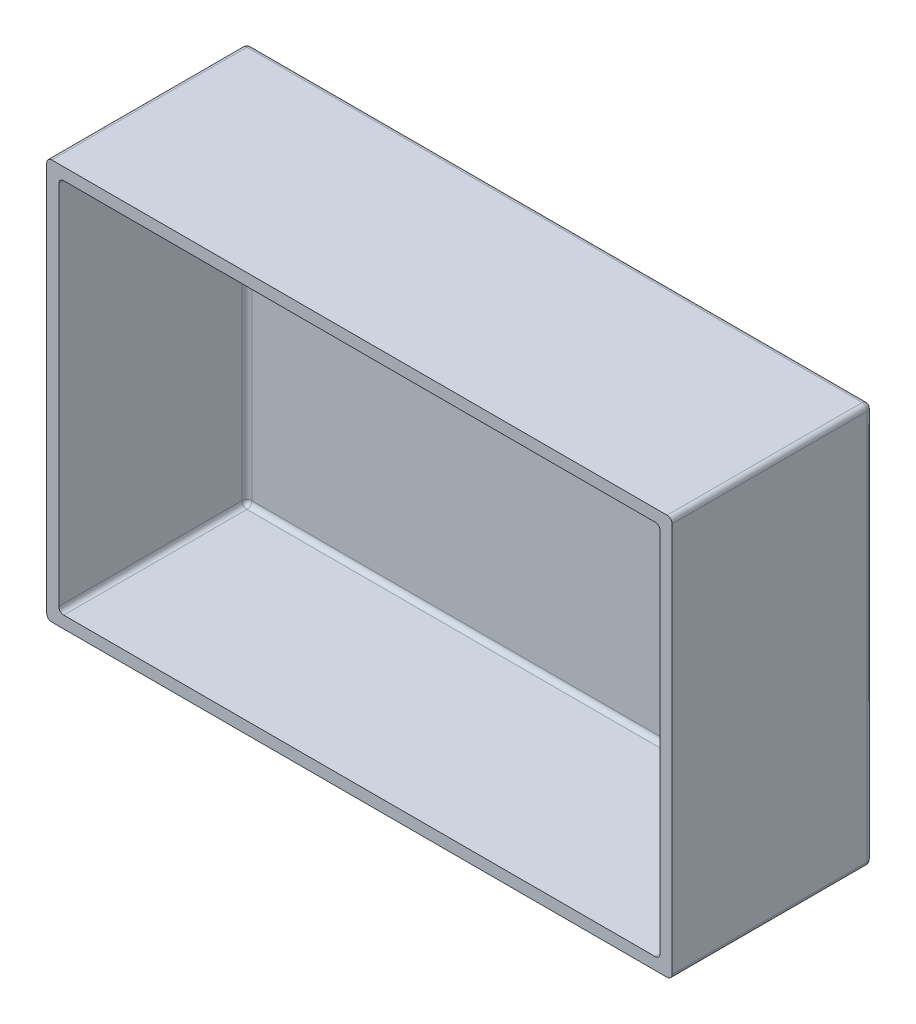
ISO-10303-21;
HEADER;
FILE_DESCRIPTION(('STEP AP214'),'2;1');
FILE_NAME('part.step','',(''),(''),'','','');
FILE_SCHEMA(('AUTOMOTIVE_DESIGN { 1 0 10303 214 1 1 1 1 }'));
ENDSEC;
DATA;
#1=APPLICATION_CONTEXT('core data for automotive mechanical design processes');
#2=APPLICATION_PROTOCOL_DEFINITION('international standard','automotive_design',2000,#1);
#3=PRODUCT_CONTEXT('',#1,'mechanical');
#4=PRODUCT('Part','Part','',(#3));
#5=PRODUCT_RELATED_PRODUCT_CATEGORY('part','',(#4));
#6=PRODUCT_DEFINITION_FORMATION('','',#4);
#7=PRODUCT_DEFINITION_CONTEXT('part definition',#1,'design');
#8=PRODUCT_DEFINITION('design','',#6,#7);
#9=PRODUCT_DEFINITION_SHAPE('','',#8);
#10=(LENGTH_UNIT() NAMED_UNIT(*) SI_UNIT(.MILLI.,.METRE.));
#11=(NAMED_UNIT(*) PLANE_ANGLE_UNIT() SI_UNIT($,.RADIAN.));
#12=(NAMED_UNIT(*) SI_UNIT($,.STERADIAN.) SOLID_ANGLE_UNIT());
#13=UNCERTAINTY_MEASURE_WITH_UNIT(LENGTH_MEASURE(1.E-05),#10,'distance_accuracy_value','');
#14=(GEOMETRIC_REPRESENTATION_CONTEXT(3) GLOBAL_UNCERTAINTY_ASSIGNED_CONTEXT((#13)) GLOBAL_UNIT_ASSIGNED_CONTEXT((#10,
#11,#12)) REPRESENTATION_CONTEXT('',''));
#15=CARTESIAN_POINT('',(0.,0.,0.));
#16=DIRECTION('',(0.,0.,1.));
#17=DIRECTION('',(1.,0.,0.));
#18=AXIS2_PLACEMENT_3D('',#15,#16,#17);
#19=CARTESIAN_POINT('',(62.5,40.,40.));
#20=DIRECTION('',(-1.,0.,0.));
#21=DIRECTION('',(0.,0.,1.));
#22=AXIS2_PLACEMENT_3D('',#19,#20,#21);
#23=PLANE('',#22);
#24=DIRECTION('',(0.,1.,0.));
#25=VECTOR('',#24,1.);
#26=CARTESIAN_POINT('',(62.5,40.,40.));
#27=LINE('',#26,#25);
#28=CARTESIAN_POINT('',(62.5,-39.,40.));
#29=VERTEX_POINT('',#28);
#30=CARTESIAN_POINT('',(62.5,39.,40.));
#31=VERTEX_POINT('',#30);
#32=EDGE_CURVE('E359',#29,#31,#27,.T.);
#33=ORIENTED_EDGE('',*,*,#32,.F.);
#34=DIRECTION('',(0.,0.,-1.));
#35=VECTOR('',#34,1.);
#36=CARTESIAN_POINT('',(62.5,-39.,40.));
#37=LINE('',#36,#35);
#38=CARTESIAN_POINT('',(62.5,-39.,1.));
#39=VERTEX_POINT('',#38);
#40=EDGE_CURVE('E220',#29,#39,#37,.T.);
#41=ORIENTED_EDGE('',*,*,#40,.T.);
#42=DIRECTION('',(0.,1.,0.));
#43=VECTOR('',#42,1.);
#44=CARTESIAN_POINT('',(62.5,40.,1.));
#45=LINE('',#44,#43);
#46=CARTESIAN_POINT('',(62.5,39.,1.));
#47=VERTEX_POINT('',#46);
#48=EDGE_CURVE('E216',#39,#47,#45,.T.);
#49=ORIENTED_EDGE('',*,*,#48,.T.);
#50=DIRECTION('',(0.,0.,-1.));
#51=VECTOR('',#50,1.);
#52=CARTESIAN_POINT('',(62.5,39.,40.));
#53=LINE('',#52,#51);
#54=EDGE_CURVE('E218',#47,#31,#53,.F.);
#55=ORIENTED_EDGE('',*,*,#54,.T.);
#56=EDGE_LOOP('',(#33,#41,#49,#55));
#57=FACE_BOUND('',#56,.T.);
#58=ADVANCED_FACE('F36',(#57),#23,.F.);
#59=CARTESIAN_POINT('',(-62.5,40.,40.));
#60=DIRECTION('',(0.,-1.,0.));
#61=DIRECTION('',(0.,0.,-1.));
#62=AXIS2_PLACEMENT_3D('',#59,#60,#61);
#63=PLANE('',#62);
#64=DIRECTION('',(-1.,0.,0.));
#65=VECTOR('',#64,1.);
#66=CARTESIAN_POINT('',(-62.5,40.,40.));
#67=LINE('',#66,#65);
#68=CARTESIAN_POINT('',(61.5,40.,40.));
#69=VERTEX_POINT('',#68);
#70=CARTESIAN_POINT('',(-61.5,40.,40.));
#71=VERTEX_POINT('',#70);
#72=EDGE_CURVE('E182',#69,#71,#67,.T.);
#73=ORIENTED_EDGE('',*,*,#72,.F.);
#74=DIRECTION('',(0.,0.,-1.));
#75=VECTOR('',#74,1.);
#76=CARTESIAN_POINT('',(61.5,40.,40.));
#77=LINE('',#76,#75);
#78=CARTESIAN_POINT('',(61.5,40.,1.));
#79=VERTEX_POINT('',#78);
#80=EDGE_CURVE('E236',#69,#79,#77,.T.);
#81=ORIENTED_EDGE('',*,*,#80,.T.);
#82=DIRECTION('',(-1.,0.,0.));
#83=VECTOR('',#82,1.);
#84=CARTESIAN_POINT('',(-62.5,40.,1.));
#85=LINE('',#84,#83);
#86=CARTESIAN_POINT('',(-61.5,40.,1.));
#87=VERTEX_POINT('',#86);
#88=EDGE_CURVE('E234',#79,#87,#85,.T.);
#89=ORIENTED_EDGE('',*,*,#88,.T.);
#90=DIRECTION('',(0.,0.,-1.));
#91=VECTOR('',#90,1.);
#92=CARTESIAN_POINT('',(-61.5,40.,40.));
#93=LINE('',#92,#91);
#94=EDGE_CURVE('E232',#87,#71,#93,.F.);
#95=ORIENTED_EDGE('',*,*,#94,.T.);
#96=EDGE_LOOP('',(#73,#81,#89,#95));
#97=FACE_BOUND('',#96,.T.);
#98=ADVANCED_FACE('F398',(#97),#63,.F.);
#99=CARTESIAN_POINT('',(-62.5,40.,40.));
#100=DIRECTION('',(1.,0.,0.));
#101=DIRECTION('',(0.,0.,-1.));
#102=AXIS2_PLACEMENT_3D('',#99,#100,#101);
#103=PLANE('',#102);
#104=DIRECTION('',(0.,-1.,0.));
#105=VECTOR('',#104,1.);
#106=CARTESIAN_POINT('',(-62.5,40.,40.));
#107=LINE('',#106,#105);
#108=CARTESIAN_POINT('',(-62.5,39.,40.));
#109=VERTEX_POINT('',#108);
#110=CARTESIAN_POINT('',(-62.5,-39.,40.));
#111=VERTEX_POINT('',#110);
#112=EDGE_CURVE('E179',#109,#111,#107,.T.);
#113=ORIENTED_EDGE('',*,*,#112,.F.);
#114=DIRECTION('',(0.,0.,-1.));
#115=VECTOR('',#114,1.);
#116=CARTESIAN_POINT('',(-62.5,39.,40.));
#117=LINE('',#116,#115);
#118=CARTESIAN_POINT('',(-62.5,39.,1.));
#119=VERTEX_POINT('',#118);
#120=EDGE_CURVE('E192',#109,#119,#117,.T.);
#121=ORIENTED_EDGE('',*,*,#120,.T.);
#122=DIRECTION('',(0.,-1.,0.));
#123=VECTOR('',#122,1.);
#124=CARTESIAN_POINT('',(-62.5,40.,1.));
#125=LINE('',#124,#123);
#126=CARTESIAN_POINT('',(-62.5,-39.,1.));
#127=VERTEX_POINT('',#126);
#128=EDGE_CURVE('E203',#119,#127,#125,.T.);
#129=ORIENTED_EDGE('',*,*,#128,.T.);
#130=DIRECTION('',(0.,0.,-1.));
#131=VECTOR('',#130,1.);
#132=CARTESIAN_POINT('',(-62.5,-39.,40.));
#133=LINE('',#132,#131);
#134=EDGE_CURVE('E195',#127,#111,#133,.F.);
#135=ORIENTED_EDGE('',*,*,#134,.T.);
#136=EDGE_LOOP('',(#113,#121,#129,#135));
#137=FACE_BOUND('',#136,.T.);
#138=ADVANCED_FACE('F190',(#137),#103,.F.);
#139=CARTESIAN_POINT('',(-62.5,-40.,40.));
#140=DIRECTION('',(0.,1.,0.));
#141=DIRECTION('',(0.,0.,1.));
#142=AXIS2_PLACEMENT_3D('',#139,#140,#141);
#143=PLANE('',#142);
#144=DIRECTION('',(1.,0.,0.));
#145=VECTOR('',#144,1.);
#146=CARTESIAN_POINT('',(-62.5,-40.,1.));
#147=LINE('',#146,#145);
#148=CARTESIAN_POINT('',(-61.5,-40.,1.));
#149=VERTEX_POINT('',#148);
#150=CARTESIAN_POINT('',(61.5,-40.,1.));
#151=VERTEX_POINT('',#150);
#152=EDGE_CURVE('E222',#149,#151,#147,.T.);
#153=ORIENTED_EDGE('',*,*,#152,.T.);
#154=DIRECTION('',(0.,0.,-1.));
#155=VECTOR('',#154,1.);
#156=CARTESIAN_POINT('',(61.5,-40.,40.));
#157=LINE('',#156,#155);
#158=CARTESIAN_POINT('',(61.5,-40.,40.));
#159=VERTEX_POINT('',#158);
#160=EDGE_CURVE('E226',#151,#159,#157,.F.);
#161=ORIENTED_EDGE('',*,*,#160,.T.);
#162=DIRECTION('',(1.,0.,0.));
#163=VECTOR('',#162,1.);
#164=CARTESIAN_POINT('',(-62.5,-40.,40.));
#165=LINE('',#164,#163);
#166=CARTESIAN_POINT('',(-61.5,-40.,40.));
#167=VERTEX_POINT('',#166);
#168=EDGE_CURVE('E196',#167,#159,#165,.T.);
#169=ORIENTED_EDGE('',*,*,#168,.F.);
#170=DIRECTION('',(0.,0.,-1.));
#171=VECTOR('',#170,1.);
#172=CARTESIAN_POINT('',(-61.5,-40.,40.));
#173=LINE('',#172,#171);
#174=EDGE_CURVE('E224',#167,#149,#173,.T.);
#175=ORIENTED_EDGE('',*,*,#174,.T.);
#176=EDGE_LOOP('',(#153,#161,#169,#175));
#177=FACE_BOUND('',#176,.T.);
#178=ADVANCED_FACE('F417',(#177),#143,.F.);
#179=CARTESIAN_POINT('',(0.,0.,40.));
#180=DIRECTION('',(0.,0.,1.));
#181=DIRECTION('',(1.,0.,0.));
#182=AXIS2_PLACEMENT_3D('',#179,#180,#181);
#183=PLANE('',#182);
#184=DIRECTION('',(0.,1.,0.));
#185=VECTOR('',#184,1.);
#186=CARTESIAN_POINT('',(60.1,37.6,40.));
#187=LINE('',#186,#185);
#188=CARTESIAN_POINT('',(60.1,-36.6,40.));
#189=VERTEX_POINT('',#188);
#190=CARTESIAN_POINT('',(60.1,36.6,40.));
#191=VERTEX_POINT('',#190);
#192=EDGE_CURVE('E271',#189,#191,#187,.T.);
#193=ORIENTED_EDGE('',*,*,#192,.F.);
#194=CARTESIAN_POINT('',(59.1,-36.6,40.));
#195=DIRECTION('',(0.,0.,1.));
#196=DIRECTION('',(1.,0.,0.));
#197=AXIS2_PLACEMENT_3D('',#194,#195,#196);
#198=CIRCLE('',#197,1.);
#199=CARTESIAN_POINT('',(59.1,-37.6,40.));
#200=VERTEX_POINT('',#199);
#201=EDGE_CURVE('E305',#189,#200,#198,.F.);
#202=ORIENTED_EDGE('',*,*,#201,.T.);
#203=DIRECTION('',(1.,0.,0.));
#204=VECTOR('',#203,1.);
#205=CARTESIAN_POINT('',(-60.1,-37.6,40.));
#206=LINE('',#205,#204);
#207=CARTESIAN_POINT('',(-59.1,-37.6,40.));
#208=VERTEX_POINT('',#207);
#209=EDGE_CURVE('E353',#208,#200,#206,.T.);
#210=ORIENTED_EDGE('',*,*,#209,.F.);
#211=CARTESIAN_POINT('',(-59.1,-36.6,40.));
#212=DIRECTION('',(0.,0.,1.));
#213=DIRECTION('',(1.,0.,0.));
#214=AXIS2_PLACEMENT_3D('',#211,#212,#213);
#215=CIRCLE('',#214,1.);
#216=CARTESIAN_POINT('',(-60.1,-36.6,40.));
#217=VERTEX_POINT('',#216);
#218=EDGE_CURVE('E11',#208,#217,#215,.F.);
#219=ORIENTED_EDGE('',*,*,#218,.T.);
#220=DIRECTION('',(0.,-1.,0.));
#221=VECTOR('',#220,1.);
#222=CARTESIAN_POINT('',(-60.1,37.6,40.));
#223=LINE('',#222,#221);
#224=CARTESIAN_POINT('',(-60.1,36.6,40.));
#225=VERTEX_POINT('',#224);
#226=EDGE_CURVE('E360',#225,#217,#223,.T.);
#227=ORIENTED_EDGE('',*,*,#226,.F.);
#228=CARTESIAN_POINT('',(-59.1,36.6,40.));
#229=DIRECTION('',(0.,0.,1.));
#230=DIRECTION('',(1.,0.,0.));
#231=AXIS2_PLACEMENT_3D('',#228,#229,#230);
#232=CIRCLE('',#231,1.);
#233=CARTESIAN_POINT('',(-59.1,37.6,40.));
#234=VERTEX_POINT('',#233);
#235=EDGE_CURVE('E45',#225,#234,#232,.F.);
#236=ORIENTED_EDGE('',*,*,#235,.T.);
#237=DIRECTION('',(-1.,0.,0.));
#238=VECTOR('',#237,1.);
#239=CARTESIAN_POINT('',(-60.1,37.6,40.));
#240=LINE('',#239,#238);
#241=CARTESIAN_POINT('',(59.1,37.6,40.));
#242=VERTEX_POINT('',#241);
#243=EDGE_CURVE('E364',#242,#234,#240,.T.);
#244=ORIENTED_EDGE('',*,*,#243,.F.);
#245=CARTESIAN_POINT('',(59.1,36.6,40.));
#246=DIRECTION('',(0.,0.,1.));
#247=DIRECTION('',(1.,0.,0.));
#248=AXIS2_PLACEMENT_3D('',#245,#246,#247);
#249=CIRCLE('',#248,1.);
#250=EDGE_CURVE('E303',#242,#191,#249,.F.);
#251=ORIENTED_EDGE('',*,*,#250,.T.);
#252=EDGE_LOOP('',(#193,#202,#210,#219,#227,#236,#244,#251));
#253=FACE_BOUND('',#252,.T.);
#254=ORIENTED_EDGE('',*,*,#168,.T.);
#255=CARTESIAN_POINT('',(61.5,-39.,40.));
#256=DIRECTION('',(0.,0.,1.));
#257=DIRECTION('',(1.,0.,0.));
#258=AXIS2_PLACEMENT_3D('',#255,#256,#257);
#259=CIRCLE('',#258,1.);
#260=EDGE_CURVE('E230',#159,#29,#259,.T.);
#261=ORIENTED_EDGE('',*,*,#260,.T.);
#262=ORIENTED_EDGE('',*,*,#32,.T.);
#263=CARTESIAN_POINT('',(61.5,39.,40.));
#264=DIRECTION('',(0.,0.,1.));
#265=DIRECTION('',(1.,0.,0.));
#266=AXIS2_PLACEMENT_3D('',#263,#264,#265);
#267=CIRCLE('',#266,1.);
#268=EDGE_CURVE('E186',#31,#69,#267,.T.);
#269=ORIENTED_EDGE('',*,*,#268,.T.);
#270=ORIENTED_EDGE('',*,*,#72,.T.);
#271=CARTESIAN_POINT('',(-61.5,39.,40.));
#272=DIRECTION('',(0.,0.,1.));
#273=DIRECTION('',(1.,0.,0.));
#274=AXIS2_PLACEMENT_3D('',#271,#272,#273);
#275=CIRCLE('',#274,1.);
#276=EDGE_CURVE('E175',#71,#109,#275,.T.);
#277=ORIENTED_EDGE('',*,*,#276,.T.);
#278=ORIENTED_EDGE('',*,*,#112,.T.);
#279=CARTESIAN_POINT('',(-61.5,-39.,40.));
#280=DIRECTION('',(0.,0.,1.));
#281=DIRECTION('',(1.,0.,0.));
#282=AXIS2_PLACEMENT_3D('',#279,#280,#281);
#283=CIRCLE('',#282,1.);
#284=EDGE_CURVE('E187',#111,#167,#283,.T.);
#285=ORIENTED_EDGE('',*,*,#284,.T.);
#286=EDGE_LOOP('',(#254,#261,#262,#269,#270,#277,#278,#285));
#287=FACE_BOUND('',#286,.T.);
#288=ADVANCED_FACE('F178',(#253,#287),#183,.T.);
#289=CARTESIAN_POINT('',(0.,0.,0.));
#290=DIRECTION('',(0.,0.,1.));
#291=DIRECTION('',(1.,0.,0.));
#292=AXIS2_PLACEMENT_3D('',#289,#290,#291);
#293=PLANE('',#292);
#294=DIRECTION('',(0.,-1.,0.));
#295=VECTOR('',#294,1.);
#296=CARTESIAN_POINT('',(-61.5,0.,0.));
#297=LINE('',#296,#295);
#298=CARTESIAN_POINT('',(-61.5,-39.,0.));
#299=VERTEX_POINT('',#298);
#300=CARTESIAN_POINT('',(-61.5,39.,0.));
#301=VERTEX_POINT('',#300);
#302=EDGE_CURVE('E211',#299,#301,#297,.F.);
#303=ORIENTED_EDGE('',*,*,#302,.T.);
#304=DIRECTION('',(-1.,0.,0.));
#305=VECTOR('',#304,1.);
#306=CARTESIAN_POINT('',(0.,39.,0.));
#307=LINE('',#306,#305);
#308=CARTESIAN_POINT('',(61.5,39.,0.));
#309=VERTEX_POINT('',#308);
#310=EDGE_CURVE('E214',#301,#309,#307,.F.);
#311=ORIENTED_EDGE('',*,*,#310,.T.);
#312=DIRECTION('',(0.,1.,0.));
#313=VECTOR('',#312,1.);
#314=CARTESIAN_POINT('',(61.5,0.,0.));
#315=LINE('',#314,#313);
#316=CARTESIAN_POINT('',(61.5,-39.,0.));
#317=VERTEX_POINT('',#316);
#318=EDGE_CURVE('E205',#309,#317,#315,.F.);
#319=ORIENTED_EDGE('',*,*,#318,.T.);
#320=DIRECTION('',(1.,0.,0.));
#321=VECTOR('',#320,1.);
#322=CARTESIAN_POINT('',(0.,-39.,0.));
#323=LINE('',#322,#321);
#324=EDGE_CURVE('E202',#317,#299,#323,.F.);
#325=ORIENTED_EDGE('',*,*,#324,.T.);
#326=EDGE_LOOP('',(#303,#311,#319,#325));
#327=FACE_BOUND('',#326,.T.);
#328=ADVANCED_FACE('F678',(#327),#293,.F.);
#329=CARTESIAN_POINT('',(60.1,37.6,2.4));
#330=DIRECTION('',(1.,0.,0.));
#331=DIRECTION('',(0.,0.,-1.));
#332=AXIS2_PLACEMENT_3D('',#329,#330,#331);
#333=PLANE('',#332);
#334=ORIENTED_EDGE('',*,*,#192,.T.);
#335=DIRECTION('',(0.,0.,1.));
#336=VECTOR('',#335,1.);
#337=CARTESIAN_POINT('',(60.1,36.6,2.4));
#338=LINE('',#337,#336);
#339=CARTESIAN_POINT('',(60.1,36.6,3.4));
#340=VERTEX_POINT('',#339);
#341=EDGE_CURVE('E282',#191,#340,#338,.F.);
#342=ORIENTED_EDGE('',*,*,#341,.T.);
#343=DIRECTION('',(0.,1.,0.));
#344=VECTOR('',#343,1.);
#345=CARTESIAN_POINT('',(60.1,37.6,3.4));
#346=LINE('',#345,#344);
#347=CARTESIAN_POINT('',(60.1,-36.6,3.4));
#348=VERTEX_POINT('',#347);
#349=EDGE_CURVE('E280',#340,#348,#346,.F.);
#350=ORIENTED_EDGE('',*,*,#349,.T.);
#351=DIRECTION('',(0.,0.,1.));
#352=VECTOR('',#351,1.);
#353=CARTESIAN_POINT('',(60.1,-36.6,40.));
#354=LINE('',#353,#352);
#355=EDGE_CURVE('E278',#348,#189,#354,.T.);
#356=ORIENTED_EDGE('',*,*,#355,.T.);
#357=EDGE_LOOP('',(#334,#342,#350,#356));
#358=FACE_BOUND('',#357,.T.);
#359=ADVANCED_FACE('F670',(#358),#333,.F.);
#360=CARTESIAN_POINT('',(-60.1,-37.6,2.4));
#361=DIRECTION('',(0.,-1.,0.));
#362=DIRECTION('',(0.,0.,-1.));
#363=AXIS2_PLACEMENT_3D('',#360,#361,#362);
#364=PLANE('',#363);
#365=ORIENTED_EDGE('',*,*,#209,.T.);
#366=DIRECTION('',(0.,0.,1.));
#367=VECTOR('',#366,1.);
#368=CARTESIAN_POINT('',(59.1,-37.6,2.4));
#369=LINE('',#368,#367);
#370=CARTESIAN_POINT('',(59.1,-37.6,3.4));
#371=VERTEX_POINT('',#370);
#372=EDGE_CURVE('E297',#200,#371,#369,.F.);
#373=ORIENTED_EDGE('',*,*,#372,.T.);
#374=DIRECTION('',(1.,0.,0.));
#375=VECTOR('',#374,1.);
#376=CARTESIAN_POINT('',(-60.1,-37.6,3.4));
#377=LINE('',#376,#375);
#378=CARTESIAN_POINT('',(-59.1,-37.6,3.4));
#379=VERTEX_POINT('',#378);
#380=EDGE_CURVE('E295',#371,#379,#377,.F.);
#381=ORIENTED_EDGE('',*,*,#380,.T.);
#382=DIRECTION('',(0.,0.,1.));
#383=VECTOR('',#382,1.);
#384=CARTESIAN_POINT('',(-59.1,-37.6,40.));
#385=LINE('',#384,#383);
#386=EDGE_CURVE('E293',#379,#208,#385,.T.);
#387=ORIENTED_EDGE('',*,*,#386,.T.);
#388=EDGE_LOOP('',(#365,#373,#381,#387));
#389=FACE_BOUND('',#388,.T.);
#390=ADVANCED_FACE('F352',(#389),#364,.F.);
#391=CARTESIAN_POINT('',(-60.1,37.6,2.4));
#392=DIRECTION('',(-1.,0.,0.));
#393=DIRECTION('',(0.,0.,1.));
#394=AXIS2_PLACEMENT_3D('',#391,#392,#393);
#395=PLANE('',#394);
#396=DIRECTION('',(0.,-1.,0.));
#397=VECTOR('',#396,1.);
#398=CARTESIAN_POINT('',(-60.1,37.6,3.4));
#399=LINE('',#398,#397);
#400=CARTESIAN_POINT('',(-60.1,-36.6,3.4));
#401=VERTEX_POINT('',#400);
#402=CARTESIAN_POINT('',(-60.1,36.6,3.4));
#403=VERTEX_POINT('',#402);
#404=EDGE_CURVE('E53',#401,#403,#399,.F.);
#405=ORIENTED_EDGE('',*,*,#404,.T.);
#406=DIRECTION('',(0.,0.,1.));
#407=VECTOR('',#406,1.);
#408=CARTESIAN_POINT('',(-60.1,36.6,40.));
#409=LINE('',#408,#407);
#410=EDGE_CURVE('E301',#403,#225,#409,.T.);
#411=ORIENTED_EDGE('',*,*,#410,.T.);
#412=ORIENTED_EDGE('',*,*,#226,.T.);
#413=DIRECTION('',(0.,0.,1.));
#414=VECTOR('',#413,1.);
#415=CARTESIAN_POINT('',(-60.1,-36.6,2.4));
#416=LINE('',#415,#414);
#417=EDGE_CURVE('E58',#217,#401,#416,.F.);
#418=ORIENTED_EDGE('',*,*,#417,.T.);
#419=EDGE_LOOP('',(#405,#411,#412,#418));
#420=FACE_BOUND('',#419,.T.);
#421=ADVANCED_FACE('F653',(#420),#395,.F.);
#422=CARTESIAN_POINT('',(-60.1,37.6,2.4));
#423=DIRECTION('',(0.,1.,0.));
#424=DIRECTION('',(0.,0.,1.));
#425=AXIS2_PLACEMENT_3D('',#422,#423,#424);
#426=PLANE('',#425);
#427=DIRECTION('',(-1.,0.,0.));
#428=VECTOR('',#427,1.);
#429=CARTESIAN_POINT('',(-60.1,37.6,3.4));
#430=LINE('',#429,#428);
#431=CARTESIAN_POINT('',(-59.1,37.6,3.4));
#432=VERTEX_POINT('',#431);
#433=CARTESIAN_POINT('',(59.1,37.6,3.4));
#434=VERTEX_POINT('',#433);
#435=EDGE_CURVE('E273',#432,#434,#430,.F.);
#436=ORIENTED_EDGE('',*,*,#435,.T.);
#437=DIRECTION('',(0.,0.,1.));
#438=VECTOR('',#437,1.);
#439=CARTESIAN_POINT('',(59.1,37.6,40.));
#440=LINE('',#439,#438);
#441=EDGE_CURVE('E275',#434,#242,#440,.T.);
#442=ORIENTED_EDGE('',*,*,#441,.T.);
#443=ORIENTED_EDGE('',*,*,#243,.T.);
#444=DIRECTION('',(0.,0.,1.));
#445=VECTOR('',#444,1.);
#446=CARTESIAN_POINT('',(-59.1,37.6,2.4));
#447=LINE('',#446,#445);
#448=EDGE_CURVE('E238',#234,#432,#447,.F.);
#449=ORIENTED_EDGE('',*,*,#448,.T.);
#450=EDGE_LOOP('',(#436,#442,#443,#449));
#451=FACE_BOUND('',#450,.T.);
#452=ADVANCED_FACE('F644',(#451),#426,.F.);
#453=CARTESIAN_POINT('',(0.,0.,2.4));
#454=DIRECTION('',(0.,0.,1.));
#455=DIRECTION('',(1.,0.,0.));
#456=AXIS2_PLACEMENT_3D('',#453,#454,#455);
#457=PLANE('',#456);
#458=DIRECTION('',(1.,0.,0.));
#459=VECTOR('',#458,1.);
#460=CARTESIAN_POINT('',(0.,-36.6,2.4));
#461=LINE('',#460,#459);
#462=CARTESIAN_POINT('',(-59.1,-36.6,2.4));
#463=VERTEX_POINT('',#462);
#464=CARTESIAN_POINT('',(59.1,-36.6,2.4));
#465=VERTEX_POINT('',#464);
#466=EDGE_CURVE('E286',#463,#465,#461,.T.);
#467=ORIENTED_EDGE('',*,*,#466,.T.);
#468=DIRECTION('',(0.,1.,0.));
#469=VECTOR('',#468,1.);
#470=CARTESIAN_POINT('',(59.1,0.,2.4));
#471=LINE('',#470,#469);
#472=CARTESIAN_POINT('',(59.1,36.6,2.4));
#473=VERTEX_POINT('',#472);
#474=EDGE_CURVE('E290',#465,#473,#471,.T.);
#475=ORIENTED_EDGE('',*,*,#474,.T.);
#476=DIRECTION('',(-1.,0.,0.));
#477=VECTOR('',#476,1.);
#478=CARTESIAN_POINT('',(0.,36.6,2.4));
#479=LINE('',#478,#477);
#480=CARTESIAN_POINT('',(-59.1,36.6,2.4));
#481=VERTEX_POINT('',#480);
#482=EDGE_CURVE('E288',#473,#481,#479,.T.);
#483=ORIENTED_EDGE('',*,*,#482,.T.);
#484=DIRECTION('',(0.,-1.,0.));
#485=VECTOR('',#484,1.);
#486=CARTESIAN_POINT('',(-59.1,0.,2.4));
#487=LINE('',#486,#485);
#488=EDGE_CURVE('E284',#481,#463,#487,.T.);
#489=ORIENTED_EDGE('',*,*,#488,.T.);
#490=EDGE_LOOP('',(#467,#475,#483,#489));
#491=FACE_BOUND('',#490,.T.);
#492=ADVANCED_FACE('F636',(#491),#457,.T.);
#493=CARTESIAN_POINT('',(61.5,39.,40.));
#494=DIRECTION('',(0.,0.,-1.));
#495=DIRECTION('',(-1.,0.,0.));
#496=AXIS2_PLACEMENT_3D('',#493,#494,#495);
#497=CYLINDRICAL_SURFACE('',#496,1.);
#498=ORIENTED_EDGE('',*,*,#268,.F.);
#499=ORIENTED_EDGE('',*,*,#54,.F.);
#500=CARTESIAN_POINT('',(61.5,39.,1.));
#501=DIRECTION('',(0.,0.,-1.));
#502=DIRECTION('',(-1.,0.,0.));
#503=AXIS2_PLACEMENT_3D('',#500,#501,#502);
#504=CIRCLE('',#503,1.);
#505=EDGE_CURVE('E265',#79,#47,#504,.T.);
#506=ORIENTED_EDGE('',*,*,#505,.F.);
#507=ORIENTED_EDGE('',*,*,#80,.F.);
#508=EDGE_LOOP('',(#498,#499,#506,#507));
#509=FACE_BOUND('',#508,.T.);
#510=ADVANCED_FACE('F396',(#509),#497,.T.);
#511=CARTESIAN_POINT('',(61.5,-39.,40.));
#512=DIRECTION('',(0.,0.,-1.));
#513=DIRECTION('',(-1.,0.,0.));
#514=AXIS2_PLACEMENT_3D('',#511,#512,#513);
#515=CYLINDRICAL_SURFACE('',#514,1.);
#516=ORIENTED_EDGE('',*,*,#260,.F.);
#517=ORIENTED_EDGE('',*,*,#160,.F.);
#518=CARTESIAN_POINT('',(61.5,-39.,1.));
#519=DIRECTION('',(0.,0.,-1.));
#520=DIRECTION('',(-1.,0.,0.));
#521=AXIS2_PLACEMENT_3D('',#518,#519,#520);
#522=CIRCLE('',#521,1.);
#523=EDGE_CURVE('E262',#39,#151,#522,.T.);
#524=ORIENTED_EDGE('',*,*,#523,.F.);
#525=ORIENTED_EDGE('',*,*,#40,.F.);
#526=EDGE_LOOP('',(#516,#517,#524,#525));
#527=FACE_BOUND('',#526,.T.);
#528=ADVANCED_FACE('F377',(#527),#515,.T.);
#529=CARTESIAN_POINT('',(61.5,40.,1.));
#530=DIRECTION('',(0.,1.,0.));
#531=DIRECTION('',(0.,0.,1.));
#532=AXIS2_PLACEMENT_3D('',#529,#530,#531);
#533=CYLINDRICAL_SURFACE('',#532,1.);
#534=CARTESIAN_POINT('',(61.5,39.,1.));
#535=DIRECTION('',(0.,1.,0.));
#536=DIRECTION('',(0.,0.,1.));
#537=AXIS2_PLACEMENT_3D('',#534,#535,#536);
#538=CIRCLE('',#537,1.);
#539=EDGE_CURVE('E268',#47,#309,#538,.T.);
#540=ORIENTED_EDGE('',*,*,#539,.F.);
#541=ORIENTED_EDGE('',*,*,#48,.F.);
#542=CARTESIAN_POINT('',(61.5,-39.,1.));
#543=DIRECTION('',(0.,-1.,0.));
#544=DIRECTION('',(0.,0.,-1.));
#545=AXIS2_PLACEMENT_3D('',#542,#543,#544);
#546=CIRCLE('',#545,1.);
#547=EDGE_CURVE('E259',#317,#39,#546,.T.);
#548=ORIENTED_EDGE('',*,*,#547,.F.);
#549=ORIENTED_EDGE('',*,*,#318,.F.);
#550=EDGE_LOOP('',(#540,#541,#548,#549));
#551=FACE_BOUND('',#550,.T.);
#552=ADVANCED_FACE('F385',(#551),#533,.T.);
#553=CARTESIAN_POINT('',(61.5,39.,1.));
#554=DIRECTION('',(0.,0.,1.));
#555=DIRECTION('',(1.,0.,0.));
#556=AXIS2_PLACEMENT_3D('',#553,#554,#555);
#557=SPHERICAL_SURFACE('',#556,1.);
#558=ORIENTED_EDGE('',*,*,#505,.T.);
#559=ORIENTED_EDGE('',*,*,#539,.T.);
#560=CARTESIAN_POINT('',(61.5,39.,1.));
#561=DIRECTION('',(1.,0.,0.));
#562=DIRECTION('',(0.,1.,0.));
#563=AXIS2_PLACEMENT_3D('',#560,#561,#562);
#564=CIRCLE('',#563,1.);
#565=EDGE_CURVE('E256',#79,#309,#564,.F.);
#566=ORIENTED_EDGE('',*,*,#565,.F.);
#567=EDGE_LOOP('',(#558,#559,#566));
#568=FACE_BOUND('',#567,.T.);
#569=ADVANCED_FACE('F391',(#568),#557,.T.);
#570=CARTESIAN_POINT('',(61.5,-39.,1.));
#571=DIRECTION('',(0.,0.,1.));
#572=DIRECTION('',(1.,0.,0.));
#573=AXIS2_PLACEMENT_3D('',#570,#571,#572);
#574=SPHERICAL_SURFACE('',#573,1.);
#575=ORIENTED_EDGE('',*,*,#547,.T.);
#576=ORIENTED_EDGE('',*,*,#523,.T.);
#577=CARTESIAN_POINT('',(61.5,-39.,1.));
#578=DIRECTION('',(1.,0.,0.));
#579=DIRECTION('',(0.,0.,-1.));
#580=AXIS2_PLACEMENT_3D('',#577,#578,#579);
#581=CIRCLE('',#580,1.);
#582=EDGE_CURVE('E253',#317,#151,#581,.F.);
#583=ORIENTED_EDGE('',*,*,#582,.F.);
#584=EDGE_LOOP('',(#575,#576,#583));
#585=FACE_BOUND('',#584,.T.);
#586=ADVANCED_FACE('F422',(#585),#574,.T.);
#587=CARTESIAN_POINT('',(-62.5,39.,1.));
#588=DIRECTION('',(-1.,0.,0.));
#589=DIRECTION('',(0.,0.,1.));
#590=AXIS2_PLACEMENT_3D('',#587,#588,#589);
#591=CYLINDRICAL_SURFACE('',#590,1.);
#592=ORIENTED_EDGE('',*,*,#565,.T.);
#593=ORIENTED_EDGE('',*,*,#310,.F.);
#594=CARTESIAN_POINT('',(-61.5,39.,1.));
#595=DIRECTION('',(-1.,0.,0.));
#596=DIRECTION('',(0.,0.,1.));
#597=AXIS2_PLACEMENT_3D('',#594,#595,#596);
#598=CIRCLE('',#597,1.);
#599=EDGE_CURVE('E250',#87,#301,#598,.T.);
#600=ORIENTED_EDGE('',*,*,#599,.F.);
#601=ORIENTED_EDGE('',*,*,#88,.F.);
#602=EDGE_LOOP('',(#592,#593,#600,#601));
#603=FACE_BOUND('',#602,.T.);
#604=ADVANCED_FACE('F402',(#603),#591,.T.);
#605=CARTESIAN_POINT('',(-61.5,39.,40.));
#606=DIRECTION('',(0.,0.,-1.));
#607=DIRECTION('',(-1.,0.,0.));
#608=AXIS2_PLACEMENT_3D('',#605,#606,#607);
#609=CYLINDRICAL_SURFACE('',#608,1.);
#610=ORIENTED_EDGE('',*,*,#276,.F.);
#611=ORIENTED_EDGE('',*,*,#94,.F.);
#612=CARTESIAN_POINT('',(-61.5,39.,1.));
#613=DIRECTION('',(0.,0.,-1.));
#614=DIRECTION('',(-1.,0.,0.));
#615=AXIS2_PLACEMENT_3D('',#612,#613,#614);
#616=CIRCLE('',#615,1.);
#617=EDGE_CURVE('E200',#119,#87,#616,.T.);
#618=ORIENTED_EDGE('',*,*,#617,.F.);
#619=ORIENTED_EDGE('',*,*,#120,.F.);
#620=EDGE_LOOP('',(#610,#611,#618,#619));
#621=FACE_BOUND('',#620,.T.);
#622=ADVANCED_FACE('F198',(#621),#609,.T.);
#623=CARTESIAN_POINT('',(-61.5,-39.,40.));
#624=DIRECTION('',(0.,0.,-1.));
#625=DIRECTION('',(-1.,0.,0.));
#626=AXIS2_PLACEMENT_3D('',#623,#624,#625);
#627=CYLINDRICAL_SURFACE('',#626,1.);
#628=ORIENTED_EDGE('',*,*,#284,.F.);
#629=ORIENTED_EDGE('',*,*,#134,.F.);
#630=CARTESIAN_POINT('',(-61.5,-39.,1.));
#631=DIRECTION('',(0.,0.,-1.));
#632=DIRECTION('',(-1.,0.,0.));
#633=AXIS2_PLACEMENT_3D('',#630,#631,#632);
#634=CIRCLE('',#633,1.);
#635=EDGE_CURVE('E246',#149,#127,#634,.T.);
#636=ORIENTED_EDGE('',*,*,#635,.F.);
#637=ORIENTED_EDGE('',*,*,#174,.F.);
#638=EDGE_LOOP('',(#628,#629,#636,#637));
#639=FACE_BOUND('',#638,.T.);
#640=ADVANCED_FACE('F415',(#639),#627,.T.);
#641=CARTESIAN_POINT('',(-62.5,-39.,1.));
#642=DIRECTION('',(1.,0.,0.));
#643=DIRECTION('',(0.,0.,-1.));
#644=AXIS2_PLACEMENT_3D('',#641,#642,#643);
#645=CYLINDRICAL_SURFACE('',#644,1.);
#646=ORIENTED_EDGE('',*,*,#582,.T.);
#647=ORIENTED_EDGE('',*,*,#152,.F.);
#648=CARTESIAN_POINT('',(-61.5,-39.,1.));
#649=DIRECTION('',(-1.,0.,0.));
#650=DIRECTION('',(0.,0.,1.));
#651=AXIS2_PLACEMENT_3D('',#648,#649,#650);
#652=CIRCLE('',#651,1.);
#653=EDGE_CURVE('E243',#299,#149,#652,.T.);
#654=ORIENTED_EDGE('',*,*,#653,.F.);
#655=ORIENTED_EDGE('',*,*,#324,.F.);
#656=EDGE_LOOP('',(#646,#647,#654,#655));
#657=FACE_BOUND('',#656,.T.);
#658=ADVANCED_FACE('F419',(#657),#645,.T.);
#659=CARTESIAN_POINT('',(-61.5,39.,1.));
#660=DIRECTION('',(0.,0.,1.));
#661=DIRECTION('',(1.,0.,0.));
#662=AXIS2_PLACEMENT_3D('',#659,#660,#661);
#663=SPHERICAL_SURFACE('',#662,1.);
#664=ORIENTED_EDGE('',*,*,#617,.T.);
#665=ORIENTED_EDGE('',*,*,#599,.T.);
#666=CARTESIAN_POINT('',(-61.5,39.,1.));
#667=DIRECTION('',(0.,1.,0.));
#668=DIRECTION('',(0.,0.,1.));
#669=AXIS2_PLACEMENT_3D('',#666,#667,#668);
#670=CIRCLE('',#669,1.);
#671=EDGE_CURVE('E241',#119,#301,#670,.F.);
#672=ORIENTED_EDGE('',*,*,#671,.F.);
#673=EDGE_LOOP('',(#664,#665,#672));
#674=FACE_BOUND('',#673,.T.);
#675=ADVANCED_FACE('F404',(#674),#663,.T.);
#676=CARTESIAN_POINT('',(-61.5,-39.,1.));
#677=DIRECTION('',(0.,0.,1.));
#678=DIRECTION('',(1.,0.,0.));
#679=AXIS2_PLACEMENT_3D('',#676,#677,#678);
#680=SPHERICAL_SURFACE('',#679,1.);
#681=ORIENTED_EDGE('',*,*,#653,.T.);
#682=ORIENTED_EDGE('',*,*,#635,.T.);
#683=CARTESIAN_POINT('',(-61.5,-39.,1.));
#684=DIRECTION('',(0.,-1.,0.));
#685=DIRECTION('',(0.,0.,-1.));
#686=AXIS2_PLACEMENT_3D('',#683,#684,#685);
#687=CIRCLE('',#686,1.);
#688=EDGE_CURVE('E239',#299,#127,#687,.F.);
#689=ORIENTED_EDGE('',*,*,#688,.F.);
#690=EDGE_LOOP('',(#681,#682,#689));
#691=FACE_BOUND('',#690,.T.);
#692=ADVANCED_FACE('F412',(#691),#680,.T.);
#693=CARTESIAN_POINT('',(-61.5,40.,1.));
#694=DIRECTION('',(0.,-1.,0.));
#695=DIRECTION('',(0.,0.,-1.));
#696=AXIS2_PLACEMENT_3D('',#693,#694,#695);
#697=CYLINDRICAL_SURFACE('',#696,1.);
#698=ORIENTED_EDGE('',*,*,#671,.T.);
#699=ORIENTED_EDGE('',*,*,#302,.F.);
#700=ORIENTED_EDGE('',*,*,#688,.T.);
#701=ORIENTED_EDGE('',*,*,#128,.F.);
#702=EDGE_LOOP('',(#698,#699,#700,#701));
#703=FACE_BOUND('',#702,.T.);
#704=ADVANCED_FACE('F408',(#703),#697,.T.);
#705=CARTESIAN_POINT('',(-59.1,-36.6,2.4));
#706=DIRECTION('',(0.,0.,-1.));
#707=DIRECTION('',(-1.,0.,0.));
#708=AXIS2_PLACEMENT_3D('',#705,#706,#707);
#709=CYLINDRICAL_SURFACE('',#708,1.);
#710=CARTESIAN_POINT('',(-59.1,-36.6,3.4));
#711=DIRECTION('',(0.,0.,1.));
#712=DIRECTION('',(1.,0.,0.));
#713=AXIS2_PLACEMENT_3D('',#710,#711,#712);
#714=CIRCLE('',#713,1.);
#715=EDGE_CURVE('E40',#401,#379,#714,.T.);
#716=ORIENTED_EDGE('',*,*,#715,.F.);
#717=ORIENTED_EDGE('',*,*,#417,.F.);
#718=ORIENTED_EDGE('',*,*,#218,.F.);
#719=ORIENTED_EDGE('',*,*,#386,.F.);
#720=EDGE_LOOP('',(#716,#717,#718,#719));
#721=FACE_BOUND('',#720,.T.);
#722=ADVANCED_FACE('F38',(#721),#709,.F.);
#723=CARTESIAN_POINT('',(-59.1,-36.6,3.4));
#724=DIRECTION('',(0.,0.,1.));
#725=DIRECTION('',(1.,0.,0.));
#726=AXIS2_PLACEMENT_3D('',#723,#724,#725);
#727=SPHERICAL_SURFACE('',#726,1.);
#728=CARTESIAN_POINT('',(-59.1,-36.6,3.4));
#729=DIRECTION('',(0.,1.,0.));
#730=DIRECTION('',(0.,0.,1.));
#731=AXIS2_PLACEMENT_3D('',#728,#729,#730);
#732=CIRCLE('',#731,1.);
#733=EDGE_CURVE('E334',#401,#463,#732,.F.);
#734=ORIENTED_EDGE('',*,*,#733,.F.);
#735=ORIENTED_EDGE('',*,*,#715,.T.);
#736=CARTESIAN_POINT('',(-59.1,-36.6,3.4));
#737=DIRECTION('',(1.,0.,0.));
#738=DIRECTION('',(0.,0.,-1.));
#739=AXIS2_PLACEMENT_3D('',#736,#737,#738);
#740=CIRCLE('',#739,1.);
#741=EDGE_CURVE('E336',#463,#379,#740,.F.);
#742=ORIENTED_EDGE('',*,*,#741,.F.);
#743=EDGE_LOOP('',(#734,#735,#742));
#744=FACE_BOUND('',#743,.T.);
#745=ADVANCED_FACE('F345',(#744),#727,.F.);
#746=CARTESIAN_POINT('',(59.1,-36.6,2.4));
#747=DIRECTION('',(0.,0.,-1.));
#748=DIRECTION('',(-1.,0.,0.));
#749=AXIS2_PLACEMENT_3D('',#746,#747,#748);
#750=CYLINDRICAL_SURFACE('',#749,1.);
#751=ORIENTED_EDGE('',*,*,#201,.F.);
#752=ORIENTED_EDGE('',*,*,#355,.F.);
#753=CARTESIAN_POINT('',(59.1,-36.6,3.4));
#754=DIRECTION('',(0.,0.,1.));
#755=DIRECTION('',(1.,0.,0.));
#756=AXIS2_PLACEMENT_3D('',#753,#754,#755);
#757=CIRCLE('',#756,1.);
#758=EDGE_CURVE('E331',#371,#348,#757,.T.);
#759=ORIENTED_EDGE('',*,*,#758,.F.);
#760=ORIENTED_EDGE('',*,*,#372,.F.);
#761=EDGE_LOOP('',(#751,#752,#759,#760));
#762=FACE_BOUND('',#761,.T.);
#763=ADVANCED_FACE('F487',(#762),#750,.F.);
#764=CARTESIAN_POINT('',(0.,-36.6,3.4));
#765=DIRECTION('',(1.,0.,0.));
#766=DIRECTION('',(0.,0.,-1.));
#767=AXIS2_PLACEMENT_3D('',#764,#765,#766);
#768=CYLINDRICAL_SURFACE('',#767,1.);
#769=ORIENTED_EDGE('',*,*,#741,.T.);
#770=ORIENTED_EDGE('',*,*,#380,.F.);
#771=CARTESIAN_POINT('',(59.1,-36.6,3.4));
#772=DIRECTION('',(-1.,0.,0.));
#773=DIRECTION('',(0.,0.,1.));
#774=AXIS2_PLACEMENT_3D('',#771,#772,#773);
#775=CIRCLE('',#774,1.);
#776=EDGE_CURVE('E328',#465,#371,#775,.T.);
#777=ORIENTED_EDGE('',*,*,#776,.F.);
#778=ORIENTED_EDGE('',*,*,#466,.F.);
#779=EDGE_LOOP('',(#769,#770,#777,#778));
#780=FACE_BOUND('',#779,.T.);
#781=ADVANCED_FACE('F493',(#780),#768,.F.);
#782=CARTESIAN_POINT('',(-59.1,0.,3.4));
#783=DIRECTION('',(0.,-1.,0.));
#784=DIRECTION('',(0.,0.,-1.));
#785=AXIS2_PLACEMENT_3D('',#782,#783,#784);
#786=CYLINDRICAL_SURFACE('',#785,1.);
#787=ORIENTED_EDGE('',*,*,#733,.T.);
#788=ORIENTED_EDGE('',*,*,#488,.F.);
#789=CARTESIAN_POINT('',(-59.1,36.6,3.4));
#790=DIRECTION('',(0.,-1.,0.));
#791=DIRECTION('',(0.,0.,-1.));
#792=AXIS2_PLACEMENT_3D('',#789,#790,#791);
#793=CIRCLE('',#792,1.);
#794=EDGE_CURVE('E325',#403,#481,#793,.T.);
#795=ORIENTED_EDGE('',*,*,#794,.F.);
#796=ORIENTED_EDGE('',*,*,#404,.F.);
#797=EDGE_LOOP('',(#787,#788,#795,#796));
#798=FACE_BOUND('',#797,.T.);
#799=ADVANCED_FACE('F501',(#798),#786,.F.);
#800=CARTESIAN_POINT('',(-59.1,36.6,2.4));
#801=DIRECTION('',(0.,0.,-1.));
#802=DIRECTION('',(-1.,0.,0.));
#803=AXIS2_PLACEMENT_3D('',#800,#801,#802);
#804=CYLINDRICAL_SURFACE('',#803,1.);
#805=ORIENTED_EDGE('',*,*,#235,.F.);
#806=ORIENTED_EDGE('',*,*,#410,.F.);
#807=CARTESIAN_POINT('',(-59.1,36.6,3.4));
#808=DIRECTION('',(0.,0.,1.));
#809=DIRECTION('',(1.,0.,0.));
#810=AXIS2_PLACEMENT_3D('',#807,#808,#809);
#811=CIRCLE('',#810,1.);
#812=EDGE_CURVE('E322',#432,#403,#811,.T.);
#813=ORIENTED_EDGE('',*,*,#812,.F.);
#814=ORIENTED_EDGE('',*,*,#448,.F.);
#815=EDGE_LOOP('',(#805,#806,#813,#814));
#816=FACE_BOUND('',#815,.T.);
#817=ADVANCED_FACE('F508',(#816),#804,.F.);
#818=CARTESIAN_POINT('',(59.1,-36.6,3.4));
#819=DIRECTION('',(0.,0.,1.));
#820=DIRECTION('',(1.,0.,0.));
#821=AXIS2_PLACEMENT_3D('',#818,#819,#820);
#822=SPHERICAL_SURFACE('',#821,1.);
#823=ORIENTED_EDGE('',*,*,#776,.T.);
#824=ORIENTED_EDGE('',*,*,#758,.T.);
#825=CARTESIAN_POINT('',(59.1,-36.6,3.4));
#826=DIRECTION('',(0.,1.,0.));
#827=DIRECTION('',(0.,0.,1.));
#828=AXIS2_PLACEMENT_3D('',#825,#826,#827);
#829=CIRCLE('',#828,1.);
#830=EDGE_CURVE('E319',#465,#348,#829,.F.);
#831=ORIENTED_EDGE('',*,*,#830,.F.);
#832=EDGE_LOOP('',(#823,#824,#831));
#833=FACE_BOUND('',#832,.T.);
#834=ADVANCED_FACE('F516',(#833),#822,.F.);
#835=CARTESIAN_POINT('',(-59.1,36.6,3.4));
#836=DIRECTION('',(0.,0.,1.));
#837=DIRECTION('',(1.,0.,0.));
#838=AXIS2_PLACEMENT_3D('',#835,#836,#837);
#839=SPHERICAL_SURFACE('',#838,1.);
#840=ORIENTED_EDGE('',*,*,#812,.T.);
#841=ORIENTED_EDGE('',*,*,#794,.T.);
#842=CARTESIAN_POINT('',(-59.1,36.6,3.4));
#843=DIRECTION('',(1.,0.,0.));
#844=DIRECTION('',(0.,0.,-1.));
#845=AXIS2_PLACEMENT_3D('',#842,#843,#844);
#846=CIRCLE('',#845,1.);
#847=EDGE_CURVE('E316',#432,#481,#846,.F.);
#848=ORIENTED_EDGE('',*,*,#847,.F.);
#849=EDGE_LOOP('',(#840,#841,#848));
#850=FACE_BOUND('',#849,.T.);
#851=ADVANCED_FACE('F524',(#850),#839,.F.);
#852=CARTESIAN_POINT('',(59.1,0.,3.4));
#853=DIRECTION('',(0.,1.,0.));
#854=DIRECTION('',(0.,0.,1.));
#855=AXIS2_PLACEMENT_3D('',#852,#853,#854);
#856=CYLINDRICAL_SURFACE('',#855,1.);
#857=ORIENTED_EDGE('',*,*,#830,.T.);
#858=ORIENTED_EDGE('',*,*,#349,.F.);
#859=CARTESIAN_POINT('',(59.1,36.6,3.4));
#860=DIRECTION('',(0.,-1.,0.));
#861=DIRECTION('',(0.,0.,-1.));
#862=AXIS2_PLACEMENT_3D('',#859,#860,#861);
#863=CIRCLE('',#862,1.);
#864=EDGE_CURVE('E313',#473,#340,#863,.T.);
#865=ORIENTED_EDGE('',*,*,#864,.F.);
#866=ORIENTED_EDGE('',*,*,#474,.F.);
#867=EDGE_LOOP('',(#857,#858,#865,#866));
#868=FACE_BOUND('',#867,.T.);
#869=ADVANCED_FACE('F532',(#868),#856,.F.);
#870=CARTESIAN_POINT('',(0.,36.6,3.4));
#871=DIRECTION('',(-1.,0.,0.));
#872=DIRECTION('',(0.,0.,1.));
#873=AXIS2_PLACEMENT_3D('',#870,#871,#872);
#874=CYLINDRICAL_SURFACE('',#873,1.);
#875=ORIENTED_EDGE('',*,*,#847,.T.);
#876=ORIENTED_EDGE('',*,*,#482,.F.);
#877=CARTESIAN_POINT('',(59.1,36.6,3.4));
#878=DIRECTION('',(-1.,0.,0.));
#879=DIRECTION('',(0.,0.,1.));
#880=AXIS2_PLACEMENT_3D('',#877,#878,#879);
#881=CIRCLE('',#880,1.);
#882=EDGE_CURVE('E311',#434,#473,#881,.T.);
#883=ORIENTED_EDGE('',*,*,#882,.F.);
#884=ORIENTED_EDGE('',*,*,#435,.F.);
#885=EDGE_LOOP('',(#875,#876,#883,#884));
#886=FACE_BOUND('',#885,.T.);
#887=ADVANCED_FACE('F540',(#886),#874,.F.);
#888=CARTESIAN_POINT('',(59.1,36.6,3.4));
#889=DIRECTION('',(0.,0.,1.));
#890=DIRECTION('',(1.,0.,0.));
#891=AXIS2_PLACEMENT_3D('',#888,#889,#890);
#892=SPHERICAL_SURFACE('',#891,1.);
#893=ORIENTED_EDGE('',*,*,#882,.T.);
#894=ORIENTED_EDGE('',*,*,#864,.T.);
#895=CARTESIAN_POINT('',(59.1,36.6,3.4));
#896=DIRECTION('',(0.,0.,1.));
#897=DIRECTION('',(1.,0.,0.));
#898=AXIS2_PLACEMENT_3D('',#895,#896,#897);
#899=CIRCLE('',#898,1.);
#900=EDGE_CURVE('E308',#434,#340,#899,.F.);
#901=ORIENTED_EDGE('',*,*,#900,.F.);
#902=EDGE_LOOP('',(#893,#894,#901));
#903=FACE_BOUND('',#902,.T.);
#904=ADVANCED_FACE('F548',(#903),#892,.F.);
#905=CARTESIAN_POINT('',(59.1,36.6,2.4));
#906=DIRECTION('',(0.,0.,-1.));
#907=DIRECTION('',(-1.,0.,0.));
#908=AXIS2_PLACEMENT_3D('',#905,#906,#907);
#909=CYLINDRICAL_SURFACE('',#908,1.);
#910=ORIENTED_EDGE('',*,*,#900,.T.);
#911=ORIENTED_EDGE('',*,*,#341,.F.);
#912=ORIENTED_EDGE('',*,*,#250,.F.);
#913=ORIENTED_EDGE('',*,*,#441,.F.);
#914=EDGE_LOOP('',(#910,#911,#912,#913));
#915=FACE_BOUND('',#914,.T.);
#916=ADVANCED_FACE('F556',(#915),#909,.F.);
#917=CLOSED_SHELL('',(#58,#98,#138,#178,#288,#328,#359,#390,#421,#452,#492,#510,#528,#552,#569,
#586,#604,#622,#640,#658,#675,#692,#704,#722,#745,#763,#781,#799,#817,#834,#851,#869,#887,#904,#916));
#918=MANIFOLD_SOLID_BREP('B2',#917);
#919=ADVANCED_BREP_SHAPE_REPRESENTATION('',(#18,#918),#14);
#920=SHAPE_DEFINITION_REPRESENTATION(#9,#919);
ENDSEC;
END-ISO-10303-21;
